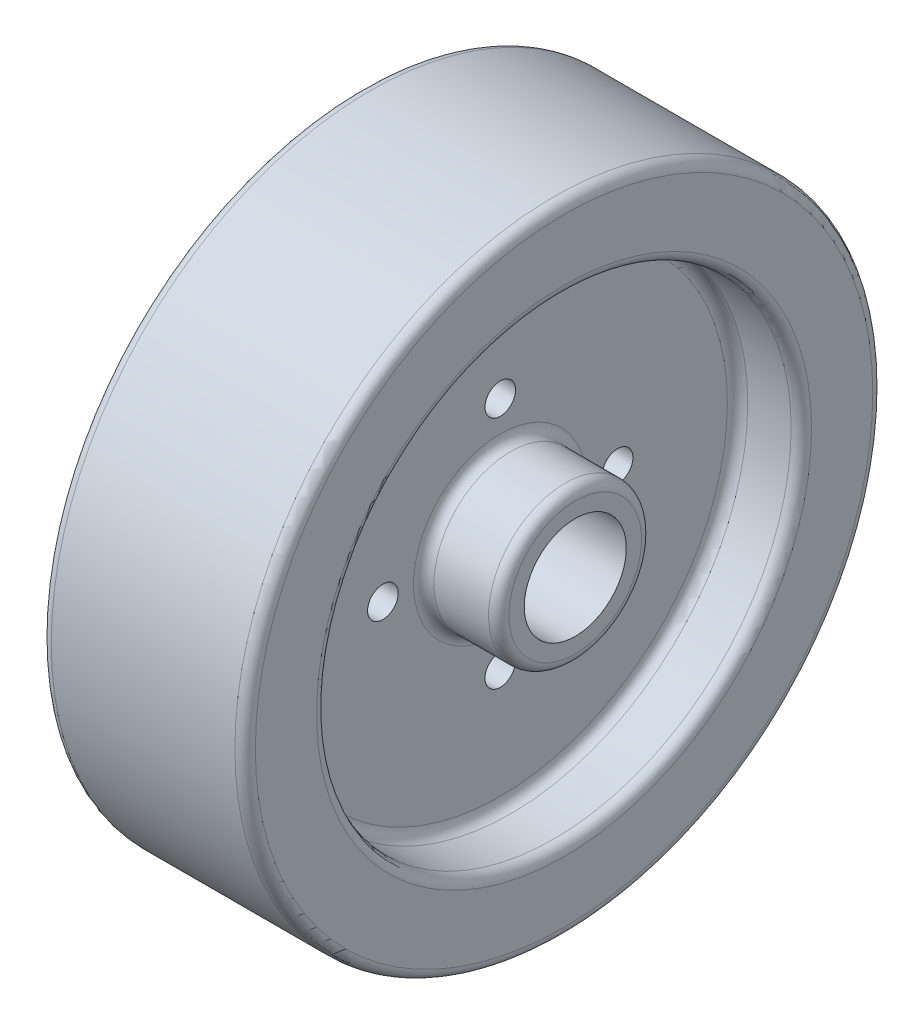
ISO-10303-21;
HEADER;
FILE_DESCRIPTION(('STEP AP214'),'2;1');
FILE_NAME('part.step','',(''),(''),'','','');
FILE_SCHEMA(('AUTOMOTIVE_DESIGN { 1 0 10303 214 1 1 1 1 }'));
ENDSEC;
DATA;
#1=APPLICATION_CONTEXT('core data for automotive mechanical design processes');
#2=APPLICATION_PROTOCOL_DEFINITION('international standard','automotive_design',2000,#1);
#3=PRODUCT_CONTEXT('',#1,'mechanical');
#4=PRODUCT('Part','Part','',(#3));
#5=PRODUCT_RELATED_PRODUCT_CATEGORY('part','',(#4));
#6=PRODUCT_DEFINITION_FORMATION('','',#4);
#7=PRODUCT_DEFINITION_CONTEXT('part definition',#1,'design');
#8=PRODUCT_DEFINITION('design','',#6,#7);
#9=PRODUCT_DEFINITION_SHAPE('','',#8);
#10=(LENGTH_UNIT() NAMED_UNIT(*) SI_UNIT(.MILLI.,.METRE.));
#11=(NAMED_UNIT(*) PLANE_ANGLE_UNIT() SI_UNIT($,.RADIAN.));
#12=(NAMED_UNIT(*) SI_UNIT($,.STERADIAN.) SOLID_ANGLE_UNIT());
#13=UNCERTAINTY_MEASURE_WITH_UNIT(LENGTH_MEASURE(1.E-05),#10,'distance_accuracy_value','');
#14=(GEOMETRIC_REPRESENTATION_CONTEXT(3) GLOBAL_UNCERTAINTY_ASSIGNED_CONTEXT((#13)) GLOBAL_UNIT_ASSIGNED_CONTEXT((#10,
#11,#12)) REPRESENTATION_CONTEXT('',''));
#15=CARTESIAN_POINT('',(0.,0.,0.));
#16=DIRECTION('',(0.,0.,1.));
#17=DIRECTION('',(1.,0.,0.));
#18=AXIS2_PLACEMENT_3D('',#15,#16,#17);
#19=CARTESIAN_POINT('',(20.,-62.5,0.));
#20=DIRECTION('',(1.,0.,0.));
#21=DIRECTION('',(0.,0.,-1.));
#22=AXIS2_PLACEMENT_3D('',#19,#20,#21);
#23=PLANE('',#22);
#24=CARTESIAN_POINT('',(20.,0.,0.));
#25=DIRECTION('',(1.,0.,0.));
#26=DIRECTION('',(0.,0.,-1.));
#27=AXIS2_PLACEMENT_3D('',#24,#25,#26);
#28=CIRCLE('',#27,48.5);
#29=CARTESIAN_POINT('',(20.,0.,-48.5));
#30=VERTEX_POINT('',#29);
#31=EDGE_CURVE('E57',#30,#30,#28,.F.);
#32=ORIENTED_EDGE('',*,*,#31,.T.);
#33=EDGE_LOOP('',(#32));
#34=FACE_BOUND('',#33,.T.);
#35=CARTESIAN_POINT('',(20.,0.,0.));
#36=DIRECTION('',(1.,0.,0.));
#37=DIRECTION('',(0.,0.,-1.));
#38=AXIS2_PLACEMENT_3D('',#35,#36,#37);
#39=CIRCLE('',#38,60.5);
#40=CARTESIAN_POINT('',(20.,0.,-60.5));
#41=VERTEX_POINT('',#40);
#42=EDGE_CURVE('E60',#41,#41,#39,.T.);
#43=ORIENTED_EDGE('',*,*,#42,.T.);
#44=EDGE_LOOP('',(#43));
#45=FACE_BOUND('',#44,.T.);
#46=ADVANCED_FACE('F37',(#34,#45),#23,.T.);
#47=CARTESIAN_POINT('',(0.,0.,0.));
#48=DIRECTION('',(-1.,0.,0.));
#49=DIRECTION('',(0.,0.,1.));
#50=AXIS2_PLACEMENT_3D('',#47,#48,#49);
#51=CYLINDRICAL_SURFACE('',#50,46.5);
#52=CARTESIAN_POINT('',(9.5,0.,0.));
#53=DIRECTION('',(1.,0.,0.));
#54=DIRECTION('',(0.,0.,-1.));
#55=AXIS2_PLACEMENT_3D('',#52,#53,#54);
#56=CIRCLE('',#55,46.5);
#57=CARTESIAN_POINT('',(9.5,0.,-46.5));
#58=VERTEX_POINT('',#57);
#59=EDGE_CURVE('E99',#58,#58,#56,.F.);
#60=ORIENTED_EDGE('',*,*,#59,.T.);
#61=EDGE_LOOP('',(#60));
#62=FACE_BOUND('',#61,.T.);
#63=CARTESIAN_POINT('',(18.,0.,0.));
#64=DIRECTION('',(1.,0.,0.));
#65=DIRECTION('',(0.,0.,-1.));
#66=AXIS2_PLACEMENT_3D('',#63,#64,#65);
#67=CIRCLE('',#66,46.5);
#68=CARTESIAN_POINT('',(18.,0.,-46.5));
#69=VERTEX_POINT('',#68);
#70=EDGE_CURVE('E102',#69,#69,#67,.T.);
#71=ORIENTED_EDGE('',*,*,#70,.T.);
#72=EDGE_LOOP('',(#71));
#73=FACE_BOUND('',#72,.T.);
#74=ADVANCED_FACE('F172',(#62,#73),#51,.F.);
#75=CARTESIAN_POINT('',(7.5,-46.5,0.));
#76=DIRECTION('',(1.,0.,0.));
#77=DIRECTION('',(0.,0.,-1.));
#78=AXIS2_PLACEMENT_3D('',#75,#76,#77);
#79=PLANE('',#78);
#80=CARTESIAN_POINT('',(7.5,0.,-23.));
#81=DIRECTION('',(1.,0.,0.));
#82=DIRECTION('',(0.,0.,-1.));
#83=AXIS2_PLACEMENT_3D('',#80,#81,#82);
#84=CIRCLE('',#83,3.);
#85=CARTESIAN_POINT('',(7.5,0.,-26.));
#86=VERTEX_POINT('',#85);
#87=EDGE_CURVE('E129',#86,#86,#84,.T.);
#88=ORIENTED_EDGE('',*,*,#87,.F.);
#89=EDGE_LOOP('',(#88));
#90=FACE_BOUND('',#89,.T.);
#91=CARTESIAN_POINT('',(7.5,-23.,0.));
#92=DIRECTION('',(1.,0.,0.));
#93=DIRECTION('',(0.,0.,-1.));
#94=AXIS2_PLACEMENT_3D('',#91,#92,#93);
#95=CIRCLE('',#94,3.);
#96=CARTESIAN_POINT('',(7.5,-23.,-3.));
#97=VERTEX_POINT('',#96);
#98=EDGE_CURVE('E123',#97,#97,#95,.T.);
#99=ORIENTED_EDGE('',*,*,#98,.F.);
#100=EDGE_LOOP('',(#99));
#101=FACE_BOUND('',#100,.T.);
#102=CARTESIAN_POINT('',(7.5,0.,23.));
#103=DIRECTION('',(1.,0.,0.));
#104=DIRECTION('',(0.,0.,-1.));
#105=AXIS2_PLACEMENT_3D('',#102,#103,#104);
#106=CIRCLE('',#105,3.);
#107=CARTESIAN_POINT('',(7.5,0.,20.));
#108=VERTEX_POINT('',#107);
#109=EDGE_CURVE('E117',#108,#108,#106,.T.);
#110=ORIENTED_EDGE('',*,*,#109,.F.);
#111=EDGE_LOOP('',(#110));
#112=FACE_BOUND('',#111,.T.);
#113=CARTESIAN_POINT('',(7.5,23.,0.));
#114=DIRECTION('',(1.,0.,0.));
#115=DIRECTION('',(0.,0.,-1.));
#116=AXIS2_PLACEMENT_3D('',#113,#114,#115);
#117=CIRCLE('',#116,3.);
#118=CARTESIAN_POINT('',(7.5,23.,-3.));
#119=VERTEX_POINT('',#118);
#120=EDGE_CURVE('E109',#119,#119,#117,.T.);
#121=ORIENTED_EDGE('',*,*,#120,.F.);
#122=EDGE_LOOP('',(#121));
#123=FACE_BOUND('',#122,.T.);
#124=CARTESIAN_POINT('',(7.5,0.,0.));
#125=DIRECTION('',(1.,0.,0.));
#126=DIRECTION('',(0.,0.,-1.));
#127=AXIS2_PLACEMENT_3D('',#124,#125,#126);
#128=CIRCLE('',#127,44.5);
#129=CARTESIAN_POINT('',(7.5,0.,-44.5));
#130=VERTEX_POINT('',#129);
#131=EDGE_CURVE('E93',#130,#130,#128,.T.);
#132=ORIENTED_EDGE('',*,*,#131,.T.);
#133=EDGE_LOOP('',(#132));
#134=FACE_BOUND('',#133,.T.);
#135=CARTESIAN_POINT('',(7.5,0.,0.));
#136=DIRECTION('',(1.,0.,0.));
#137=DIRECTION('',(0.,0.,-1.));
#138=AXIS2_PLACEMENT_3D('',#135,#136,#137);
#139=CIRCLE('',#138,17.);
#140=CARTESIAN_POINT('',(7.5,0.,-17.));
#141=VERTEX_POINT('',#140);
#142=EDGE_CURVE('E96',#141,#141,#139,.F.);
#143=ORIENTED_EDGE('',*,*,#142,.T.);
#144=EDGE_LOOP('',(#143));
#145=FACE_BOUND('',#144,.T.);
#146=ADVANCED_FACE('F178',(#90,#101,#112,#123,#134,#145),#79,.T.);
#147=CARTESIAN_POINT('',(0.,0.,0.));
#148=DIRECTION('',(-1.,0.,0.));
#149=DIRECTION('',(0.,0.,1.));
#150=AXIS2_PLACEMENT_3D('',#147,#148,#149);
#151=CYLINDRICAL_SURFACE('',#150,15.);
#152=CARTESIAN_POINT('',(9.5,0.,0.));
#153=DIRECTION('',(1.,0.,0.));
#154=DIRECTION('',(0.,0.,-1.));
#155=AXIS2_PLACEMENT_3D('',#152,#153,#154);
#156=CIRCLE('',#155,15.);
#157=CARTESIAN_POINT('',(9.5,0.,-15.));
#158=VERTEX_POINT('',#157);
#159=EDGE_CURVE('E87',#158,#158,#156,.T.);
#160=ORIENTED_EDGE('',*,*,#159,.T.);
#161=EDGE_LOOP('',(#160));
#162=FACE_BOUND('',#161,.T.);
#163=CARTESIAN_POINT('',(20.2,0.,0.));
#164=DIRECTION('',(1.,0.,0.));
#165=DIRECTION('',(0.,0.,-1.));
#166=AXIS2_PLACEMENT_3D('',#163,#164,#165);
#167=CIRCLE('',#166,15.);
#168=CARTESIAN_POINT('',(20.2,0.,-15.));
#169=VERTEX_POINT('',#168);
#170=EDGE_CURVE('E90',#169,#169,#167,.F.);
#171=ORIENTED_EDGE('',*,*,#170,.T.);
#172=EDGE_LOOP('',(#171));
#173=FACE_BOUND('',#172,.T.);
#174=ADVANCED_FACE('F198',(#162,#173),#151,.T.);
#175=CARTESIAN_POINT('',(22.2,-15.,0.));
#176=DIRECTION('',(1.,0.,0.));
#177=DIRECTION('',(0.,0.,-1.));
#178=AXIS2_PLACEMENT_3D('',#175,#176,#177);
#179=PLANE('',#178);
#180=CARTESIAN_POINT('',(22.2,0.,0.));
#181=DIRECTION('',(-1.,0.,0.));
#182=DIRECTION('',(0.,0.,1.));
#183=AXIS2_PLACEMENT_3D('',#180,#181,#182);
#184=CIRCLE('',#183,10.);
#185=CARTESIAN_POINT('',(22.2,0.,10.));
#186=VERTEX_POINT('',#185);
#187=EDGE_CURVE('E105',#186,#186,#184,.T.);
#188=ORIENTED_EDGE('',*,*,#187,.T.);
#189=EDGE_LOOP('',(#188));
#190=FACE_BOUND('',#189,.T.);
#191=CARTESIAN_POINT('',(22.2,0.,0.));
#192=DIRECTION('',(1.,0.,0.));
#193=DIRECTION('',(0.,0.,-1.));
#194=AXIS2_PLACEMENT_3D('',#191,#192,#193);
#195=CIRCLE('',#194,13.);
#196=CARTESIAN_POINT('',(22.2,0.,-13.));
#197=VERTEX_POINT('',#196);
#198=EDGE_CURVE('E44',#197,#197,#195,.T.);
#199=ORIENTED_EDGE('',*,*,#198,.T.);
#200=EDGE_LOOP('',(#199));
#201=FACE_BOUND('',#200,.T.);
#202=ADVANCED_FACE('F203',(#190,#201),#179,.T.);
#203=CARTESIAN_POINT('',(-22.2,-15.,0.));
#204=DIRECTION('',(-1.,0.,0.));
#205=DIRECTION('',(0.,0.,1.));
#206=AXIS2_PLACEMENT_3D('',#203,#204,#205);
#207=PLANE('',#206);
#208=CARTESIAN_POINT('',(-22.2,0.,0.));
#209=DIRECTION('',(-1.,0.,0.));
#210=DIRECTION('',(0.,0.,1.));
#211=AXIS2_PLACEMENT_3D('',#208,#209,#210);
#212=CIRCLE('',#211,10.);
#213=CARTESIAN_POINT('',(-22.2,0.,10.));
#214=VERTEX_POINT('',#213);
#215=EDGE_CURVE('E106',#214,#214,#212,.T.);
#216=ORIENTED_EDGE('',*,*,#215,.F.);
#217=EDGE_LOOP('',(#216));
#218=FACE_BOUND('',#217,.T.);
#219=CARTESIAN_POINT('',(-22.2,0.,0.));
#220=DIRECTION('',(-1.,0.,0.));
#221=DIRECTION('',(0.,0.,1.));
#222=AXIS2_PLACEMENT_3D('',#219,#220,#221);
#223=CIRCLE('',#222,13.);
#224=CARTESIAN_POINT('',(-22.2,0.,13.));
#225=VERTEX_POINT('',#224);
#226=EDGE_CURVE('E10',#225,#225,#223,.T.);
#227=ORIENTED_EDGE('',*,*,#226,.T.);
#228=EDGE_LOOP('',(#227));
#229=FACE_BOUND('',#228,.T.);
#230=ADVANCED_FACE('F211',(#218,#229),#207,.T.);
#231=CARTESIAN_POINT('',(0.,0.,0.));
#232=DIRECTION('',(-1.,0.,0.));
#233=DIRECTION('',(0.,0.,1.));
#234=AXIS2_PLACEMENT_3D('',#231,#232,#233);
#235=CYLINDRICAL_SURFACE('',#234,15.);
#236=CARTESIAN_POINT('',(-9.5,0.,0.));
#237=DIRECTION('',(-1.,0.,0.));
#238=DIRECTION('',(0.,0.,1.));
#239=AXIS2_PLACEMENT_3D('',#236,#237,#238);
#240=CIRCLE('',#239,15.);
#241=CARTESIAN_POINT('',(-9.5,0.,15.));
#242=VERTEX_POINT('',#241);
#243=EDGE_CURVE('E81',#242,#242,#240,.T.);
#244=ORIENTED_EDGE('',*,*,#243,.T.);
#245=EDGE_LOOP('',(#244));
#246=FACE_BOUND('',#245,.T.);
#247=CARTESIAN_POINT('',(-20.2,0.,0.));
#248=DIRECTION('',(-1.,0.,0.));
#249=DIRECTION('',(0.,0.,1.));
#250=AXIS2_PLACEMENT_3D('',#247,#248,#249);
#251=CIRCLE('',#250,15.);
#252=CARTESIAN_POINT('',(-20.2,0.,15.));
#253=VERTEX_POINT('',#252);
#254=EDGE_CURVE('E84',#253,#253,#251,.F.);
#255=ORIENTED_EDGE('',*,*,#254,.T.);
#256=EDGE_LOOP('',(#255));
#257=FACE_BOUND('',#256,.T.);
#258=ADVANCED_FACE('F142',(#246,#257),#235,.T.);
#259=CARTESIAN_POINT('',(-7.5,-46.5,0.));
#260=DIRECTION('',(-1.,0.,0.));
#261=DIRECTION('',(0.,0.,1.));
#262=AXIS2_PLACEMENT_3D('',#259,#260,#261);
#263=PLANE('',#262);
#264=CARTESIAN_POINT('',(-7.5,0.,-23.));
#265=DIRECTION('',(-1.,0.,0.));
#266=DIRECTION('',(0.,0.,1.));
#267=AXIS2_PLACEMENT_3D('',#264,#265,#266);
#268=CIRCLE('',#267,3.);
#269=CARTESIAN_POINT('',(-7.5,0.,-20.));
#270=VERTEX_POINT('',#269);
#271=EDGE_CURVE('E132',#270,#270,#268,.T.);
#272=ORIENTED_EDGE('',*,*,#271,.F.);
#273=EDGE_LOOP('',(#272));
#274=FACE_BOUND('',#273,.T.);
#275=CARTESIAN_POINT('',(-7.5,-23.,0.));
#276=DIRECTION('',(-1.,0.,0.));
#277=DIRECTION('',(0.,0.,1.));
#278=AXIS2_PLACEMENT_3D('',#275,#276,#277);
#279=CIRCLE('',#278,3.);
#280=CARTESIAN_POINT('',(-7.5,-23.,3.));
#281=VERTEX_POINT('',#280);
#282=EDGE_CURVE('E126',#281,#281,#279,.T.);
#283=ORIENTED_EDGE('',*,*,#282,.F.);
#284=EDGE_LOOP('',(#283));
#285=FACE_BOUND('',#284,.T.);
#286=CARTESIAN_POINT('',(-7.5,0.,23.));
#287=DIRECTION('',(-1.,0.,0.));
#288=DIRECTION('',(0.,0.,1.));
#289=AXIS2_PLACEMENT_3D('',#286,#287,#288);
#290=CIRCLE('',#289,3.);
#291=CARTESIAN_POINT('',(-7.5,0.,26.));
#292=VERTEX_POINT('',#291);
#293=EDGE_CURVE('E120',#292,#292,#290,.T.);
#294=ORIENTED_EDGE('',*,*,#293,.F.);
#295=EDGE_LOOP('',(#294));
#296=FACE_BOUND('',#295,.T.);
#297=CARTESIAN_POINT('',(-7.5,23.,0.));
#298=DIRECTION('',(-1.,0.,0.));
#299=DIRECTION('',(0.,0.,1.));
#300=AXIS2_PLACEMENT_3D('',#297,#298,#299);
#301=CIRCLE('',#300,3.);
#302=CARTESIAN_POINT('',(-7.5,23.,3.));
#303=VERTEX_POINT('',#302);
#304=EDGE_CURVE('E114',#303,#303,#301,.T.);
#305=ORIENTED_EDGE('',*,*,#304,.F.);
#306=EDGE_LOOP('',(#305));
#307=FACE_BOUND('',#306,.T.);
#308=CARTESIAN_POINT('',(-7.5,0.,0.));
#309=DIRECTION('',(-1.,0.,0.));
#310=DIRECTION('',(0.,0.,1.));
#311=AXIS2_PLACEMENT_3D('',#308,#309,#310);
#312=CIRCLE('',#311,17.);
#313=CARTESIAN_POINT('',(-7.5,0.,17.));
#314=VERTEX_POINT('',#313);
#315=EDGE_CURVE('E75',#314,#314,#312,.F.);
#316=ORIENTED_EDGE('',*,*,#315,.T.);
#317=EDGE_LOOP('',(#316));
#318=FACE_BOUND('',#317,.T.);
#319=CARTESIAN_POINT('',(-7.5,0.,0.));
#320=DIRECTION('',(-1.,0.,0.));
#321=DIRECTION('',(0.,0.,1.));
#322=AXIS2_PLACEMENT_3D('',#319,#320,#321);
#323=CIRCLE('',#322,44.5);
#324=CARTESIAN_POINT('',(-7.5,0.,44.5));
#325=VERTEX_POINT('',#324);
#326=EDGE_CURVE('E78',#325,#325,#323,.T.);
#327=ORIENTED_EDGE('',*,*,#326,.T.);
#328=EDGE_LOOP('',(#327));
#329=FACE_BOUND('',#328,.T.);
#330=ADVANCED_FACE('F138',(#274,#285,#296,#307,#318,#329),#263,.T.);
#331=CARTESIAN_POINT('',(0.,0.,0.));
#332=DIRECTION('',(-1.,0.,0.));
#333=DIRECTION('',(0.,0.,1.));
#334=AXIS2_PLACEMENT_3D('',#331,#332,#333);
#335=CYLINDRICAL_SURFACE('',#334,46.5);
#336=CARTESIAN_POINT('',(-9.5,0.,0.));
#337=DIRECTION('',(-1.,0.,0.));
#338=DIRECTION('',(0.,0.,1.));
#339=AXIS2_PLACEMENT_3D('',#336,#337,#338);
#340=CIRCLE('',#339,46.5);
#341=CARTESIAN_POINT('',(-9.5,0.,46.5));
#342=VERTEX_POINT('',#341);
#343=EDGE_CURVE('E69',#342,#342,#340,.F.);
#344=ORIENTED_EDGE('',*,*,#343,.T.);
#345=EDGE_LOOP('',(#344));
#346=FACE_BOUND('',#345,.T.);
#347=CARTESIAN_POINT('',(-18.,0.,0.));
#348=DIRECTION('',(-1.,0.,0.));
#349=DIRECTION('',(0.,0.,1.));
#350=AXIS2_PLACEMENT_3D('',#347,#348,#349);
#351=CIRCLE('',#350,46.5);
#352=CARTESIAN_POINT('',(-18.,0.,46.5));
#353=VERTEX_POINT('',#352);
#354=EDGE_CURVE('E72',#353,#353,#351,.T.);
#355=ORIENTED_EDGE('',*,*,#354,.T.);
#356=EDGE_LOOP('',(#355));
#357=FACE_BOUND('',#356,.T.);
#358=ADVANCED_FACE('F141',(#346,#357),#335,.F.);
#359=CARTESIAN_POINT('',(-20.,-62.5,0.));
#360=DIRECTION('',(-1.,0.,0.));
#361=DIRECTION('',(0.,0.,1.));
#362=AXIS2_PLACEMENT_3D('',#359,#360,#361);
#363=PLANE('',#362);
#364=CARTESIAN_POINT('',(-20.,0.,0.));
#365=DIRECTION('',(-1.,0.,0.));
#366=DIRECTION('',(0.,0.,1.));
#367=AXIS2_PLACEMENT_3D('',#364,#365,#366);
#368=CIRCLE('',#367,48.5);
#369=CARTESIAN_POINT('',(-20.,0.,48.5));
#370=VERTEX_POINT('',#369);
#371=EDGE_CURVE('E63',#370,#370,#368,.F.);
#372=ORIENTED_EDGE('',*,*,#371,.T.);
#373=EDGE_LOOP('',(#372));
#374=FACE_BOUND('',#373,.T.);
#375=CARTESIAN_POINT('',(-20.,0.,0.));
#376=DIRECTION('',(-1.,0.,0.));
#377=DIRECTION('',(0.,0.,1.));
#378=AXIS2_PLACEMENT_3D('',#375,#376,#377);
#379=CIRCLE('',#378,60.5);
#380=CARTESIAN_POINT('',(-20.,0.,60.5));
#381=VERTEX_POINT('',#380);
#382=EDGE_CURVE('E66',#381,#381,#379,.T.);
#383=ORIENTED_EDGE('',*,*,#382,.T.);
#384=EDGE_LOOP('',(#383));
#385=FACE_BOUND('',#384,.T.);
#386=ADVANCED_FACE('F221',(#374,#385),#363,.T.);
#387=CARTESIAN_POINT('',(0.,0.,0.));
#388=DIRECTION('',(-1.,0.,0.));
#389=DIRECTION('',(0.,0.,1.));
#390=AXIS2_PLACEMENT_3D('',#387,#388,#389);
#391=CYLINDRICAL_SURFACE('',#390,62.5);
#392=CARTESIAN_POINT('',(-18.,0.,0.));
#393=DIRECTION('',(-1.,0.,0.));
#394=DIRECTION('',(0.,0.,1.));
#395=AXIS2_PLACEMENT_3D('',#392,#393,#394);
#396=CIRCLE('',#395,62.5);
#397=CARTESIAN_POINT('',(-18.,0.,62.5));
#398=VERTEX_POINT('',#397);
#399=EDGE_CURVE('E48',#398,#398,#396,.F.);
#400=ORIENTED_EDGE('',*,*,#399,.T.);
#401=EDGE_LOOP('',(#400));
#402=FACE_BOUND('',#401,.T.);
#403=CARTESIAN_POINT('',(18.,0.,0.));
#404=DIRECTION('',(1.,0.,0.));
#405=DIRECTION('',(0.,0.,-1.));
#406=AXIS2_PLACEMENT_3D('',#403,#404,#405);
#407=CIRCLE('',#406,62.5);
#408=CARTESIAN_POINT('',(18.,0.,-62.5));
#409=VERTEX_POINT('',#408);
#410=EDGE_CURVE('E52',#409,#409,#407,.F.);
#411=ORIENTED_EDGE('',*,*,#410,.T.);
#412=EDGE_LOOP('',(#411));
#413=FACE_BOUND('',#412,.T.);
#414=ADVANCED_FACE('F187',(#402,#413),#391,.T.);
#415=CARTESIAN_POINT('',(9.5,0.,0.));
#416=DIRECTION('',(1.,0.,0.));
#417=DIRECTION('',(0.,0.,-1.));
#418=AXIS2_PLACEMENT_3D('',#415,#416,#417);
#419=TOROIDAL_SURFACE('',#418,44.5,2.);
#420=ORIENTED_EDGE('',*,*,#131,.F.);
#421=EDGE_LOOP('',(#420));
#422=FACE_BOUND('',#421,.T.);
#423=ORIENTED_EDGE('',*,*,#59,.F.);
#424=EDGE_LOOP('',(#423));
#425=FACE_BOUND('',#424,.T.);
#426=ADVANCED_FACE('F184',(#422,#425),#419,.F.);
#427=CARTESIAN_POINT('',(9.5,0.,0.));
#428=DIRECTION('',(1.,0.,0.));
#429=DIRECTION('',(0.,0.,-1.));
#430=AXIS2_PLACEMENT_3D('',#427,#428,#429);
#431=TOROIDAL_SURFACE('',#430,17.,2.);
#432=ORIENTED_EDGE('',*,*,#159,.F.);
#433=EDGE_LOOP('',(#432));
#434=FACE_BOUND('',#433,.T.);
#435=ORIENTED_EDGE('',*,*,#142,.F.);
#436=EDGE_LOOP('',(#435));
#437=FACE_BOUND('',#436,.T.);
#438=ADVANCED_FACE('F167',(#434,#437),#431,.F.);
#439=CARTESIAN_POINT('',(-9.5,0.,0.));
#440=DIRECTION('',(-1.,0.,0.));
#441=DIRECTION('',(0.,0.,1.));
#442=AXIS2_PLACEMENT_3D('',#439,#440,#441);
#443=TOROIDAL_SURFACE('',#442,17.,2.);
#444=ORIENTED_EDGE('',*,*,#315,.F.);
#445=EDGE_LOOP('',(#444));
#446=FACE_BOUND('',#445,.T.);
#447=ORIENTED_EDGE('',*,*,#243,.F.);
#448=EDGE_LOOP('',(#447));
#449=FACE_BOUND('',#448,.T.);
#450=ADVANCED_FACE('F157',(#446,#449),#443,.F.);
#451=CARTESIAN_POINT('',(-9.5,0.,0.));
#452=DIRECTION('',(-1.,0.,0.));
#453=DIRECTION('',(0.,0.,1.));
#454=AXIS2_PLACEMENT_3D('',#451,#452,#453);
#455=TOROIDAL_SURFACE('',#454,44.5,2.);
#456=ORIENTED_EDGE('',*,*,#343,.F.);
#457=EDGE_LOOP('',(#456));
#458=FACE_BOUND('',#457,.T.);
#459=ORIENTED_EDGE('',*,*,#326,.F.);
#460=EDGE_LOOP('',(#459));
#461=FACE_BOUND('',#460,.T.);
#462=ADVANCED_FACE('F154',(#458,#461),#455,.F.);
#463=CARTESIAN_POINT('',(-18.,0.,0.));
#464=DIRECTION('',(-1.,0.,0.));
#465=DIRECTION('',(0.,0.,1.));
#466=AXIS2_PLACEMENT_3D('',#463,#464,#465);
#467=TOROIDAL_SURFACE('',#466,48.5,2.);
#468=ORIENTED_EDGE('',*,*,#371,.F.);
#469=EDGE_LOOP('',(#468));
#470=FACE_BOUND('',#469,.T.);
#471=ORIENTED_EDGE('',*,*,#354,.F.);
#472=EDGE_LOOP('',(#471));
#473=FACE_BOUND('',#472,.T.);
#474=ADVANCED_FACE('F156',(#470,#473),#467,.T.);
#475=CARTESIAN_POINT('',(18.,0.,0.));
#476=DIRECTION('',(1.,0.,0.));
#477=DIRECTION('',(0.,0.,-1.));
#478=AXIS2_PLACEMENT_3D('',#475,#476,#477);
#479=TOROIDAL_SURFACE('',#478,48.5,2.);
#480=ORIENTED_EDGE('',*,*,#70,.F.);
#481=EDGE_LOOP('',(#480));
#482=FACE_BOUND('',#481,.T.);
#483=ORIENTED_EDGE('',*,*,#31,.F.);
#484=EDGE_LOOP('',(#483));
#485=FACE_BOUND('',#484,.T.);
#486=ADVANCED_FACE('F164',(#482,#485),#479,.T.);
#487=CARTESIAN_POINT('',(-18.,0.,0.));
#488=DIRECTION('',(-1.,0.,0.));
#489=DIRECTION('',(0.,0.,1.));
#490=AXIS2_PLACEMENT_3D('',#487,#488,#489);
#491=TOROIDAL_SURFACE('',#490,60.5,2.);
#492=ORIENTED_EDGE('',*,*,#399,.F.);
#493=EDGE_LOOP('',(#492));
#494=FACE_BOUND('',#493,.T.);
#495=ORIENTED_EDGE('',*,*,#382,.F.);
#496=EDGE_LOOP('',(#495));
#497=FACE_BOUND('',#496,.T.);
#498=ADVANCED_FACE('F290',(#494,#497),#491,.T.);
#499=CARTESIAN_POINT('',(18.,0.,0.));
#500=DIRECTION('',(1.,0.,0.));
#501=DIRECTION('',(0.,0.,-1.));
#502=AXIS2_PLACEMENT_3D('',#499,#500,#501);
#503=TOROIDAL_SURFACE('',#502,60.5,2.);
#504=ORIENTED_EDGE('',*,*,#42,.F.);
#505=EDGE_LOOP('',(#504));
#506=FACE_BOUND('',#505,.T.);
#507=ORIENTED_EDGE('',*,*,#410,.F.);
#508=EDGE_LOOP('',(#507));
#509=FACE_BOUND('',#508,.T.);
#510=ADVANCED_FACE('F282',(#506,#509),#503,.T.);
#511=CARTESIAN_POINT('',(20.2,0.,0.));
#512=DIRECTION('',(1.,0.,0.));
#513=DIRECTION('',(0.,0.,-1.));
#514=AXIS2_PLACEMENT_3D('',#511,#512,#513);
#515=TOROIDAL_SURFACE('',#514,13.,2.);
#516=ORIENTED_EDGE('',*,*,#198,.F.);
#517=EDGE_LOOP('',(#516));
#518=FACE_BOUND('',#517,.T.);
#519=ORIENTED_EDGE('',*,*,#170,.F.);
#520=EDGE_LOOP('',(#519));
#521=FACE_BOUND('',#520,.T.);
#522=ADVANCED_FACE('F274',(#518,#521),#515,.T.);
#523=CARTESIAN_POINT('',(-20.2,0.,0.));
#524=DIRECTION('',(-1.,0.,0.));
#525=DIRECTION('',(0.,0.,1.));
#526=AXIS2_PLACEMENT_3D('',#523,#524,#525);
#527=TOROIDAL_SURFACE('',#526,13.,2.);
#528=ORIENTED_EDGE('',*,*,#254,.F.);
#529=EDGE_LOOP('',(#528));
#530=FACE_BOUND('',#529,.T.);
#531=ORIENTED_EDGE('',*,*,#226,.F.);
#532=EDGE_LOOP('',(#531));
#533=FACE_BOUND('',#532,.T.);
#534=ADVANCED_FACE('F39',(#530,#533),#527,.T.);
#535=CARTESIAN_POINT('',(22.2,0.,0.));
#536=DIRECTION('',(-1.,0.,0.));
#537=DIRECTION('',(0.,0.,1.));
#538=AXIS2_PLACEMENT_3D('',#535,#536,#537);
#539=CYLINDRICAL_SURFACE('',#538,10.);
#540=ORIENTED_EDGE('',*,*,#187,.F.);
#541=EDGE_LOOP('',(#540));
#542=FACE_BOUND('',#541,.T.);
#543=ORIENTED_EDGE('',*,*,#215,.T.);
#544=EDGE_LOOP('',(#543));
#545=FACE_BOUND('',#544,.T.);
#546=ADVANCED_FACE('F229',(#542,#545),#539,.F.);
#547=CARTESIAN_POINT('',(12.5,23.,0.));
#548=DIRECTION('',(-1.,0.,0.));
#549=DIRECTION('',(0.,0.,1.));
#550=AXIS2_PLACEMENT_3D('',#547,#548,#549);
#551=CYLINDRICAL_SURFACE('',#550,3.);
#552=ORIENTED_EDGE('',*,*,#120,.T.);
#553=EDGE_LOOP('',(#552));
#554=FACE_BOUND('',#553,.T.);
#555=ORIENTED_EDGE('',*,*,#304,.T.);
#556=EDGE_LOOP('',(#555));
#557=FACE_BOUND('',#556,.T.);
#558=ADVANCED_FACE('F232',(#554,#557),#551,.F.);
#559=CARTESIAN_POINT('',(12.5,0.,23.));
#560=DIRECTION('',(-1.,0.,0.));
#561=DIRECTION('',(0.,0.,1.));
#562=AXIS2_PLACEMENT_3D('',#559,#560,#561);
#563=CYLINDRICAL_SURFACE('',#562,3.);
#564=ORIENTED_EDGE('',*,*,#109,.T.);
#565=EDGE_LOOP('',(#564));
#566=FACE_BOUND('',#565,.T.);
#567=ORIENTED_EDGE('',*,*,#293,.T.);
#568=EDGE_LOOP('',(#567));
#569=FACE_BOUND('',#568,.T.);
#570=ADVANCED_FACE('F236',(#566,#569),#563,.F.);
#571=CARTESIAN_POINT('',(12.5,-23.,0.));
#572=DIRECTION('',(-1.,0.,0.));
#573=DIRECTION('',(0.,0.,1.));
#574=AXIS2_PLACEMENT_3D('',#571,#572,#573);
#575=CYLINDRICAL_SURFACE('',#574,3.);
#576=ORIENTED_EDGE('',*,*,#98,.T.);
#577=EDGE_LOOP('',(#576));
#578=FACE_BOUND('',#577,.T.);
#579=ORIENTED_EDGE('',*,*,#282,.T.);
#580=EDGE_LOOP('',(#579));
#581=FACE_BOUND('',#580,.T.);
#582=ADVANCED_FACE('F240',(#578,#581),#575,.F.);
#583=CARTESIAN_POINT('',(12.5,0.,-23.));
#584=DIRECTION('',(-1.,0.,0.));
#585=DIRECTION('',(0.,0.,1.));
#586=AXIS2_PLACEMENT_3D('',#583,#584,#585);
#587=CYLINDRICAL_SURFACE('',#586,3.);
#588=ORIENTED_EDGE('',*,*,#87,.T.);
#589=EDGE_LOOP('',(#588));
#590=FACE_BOUND('',#589,.T.);
#591=ORIENTED_EDGE('',*,*,#271,.T.);
#592=EDGE_LOOP('',(#591));
#593=FACE_BOUND('',#592,.T.);
#594=ADVANCED_FACE('F136',(#590,#593),#587,.F.);
#595=CLOSED_SHELL('',(#46,#74,#146,#174,#202,#230,#258,#330,#358,#386,#414,#426,#438,#450,#462,
#474,#486,#498,#510,#522,#534,#546,#558,#570,#582,#594));
#596=MANIFOLD_SOLID_BREP('B2',#595);
#597=ADVANCED_BREP_SHAPE_REPRESENTATION('',(#18,#596),#14);
#598=SHAPE_DEFINITION_REPRESENTATION(#9,#597);
ENDSEC;
END-ISO-10303-21;
